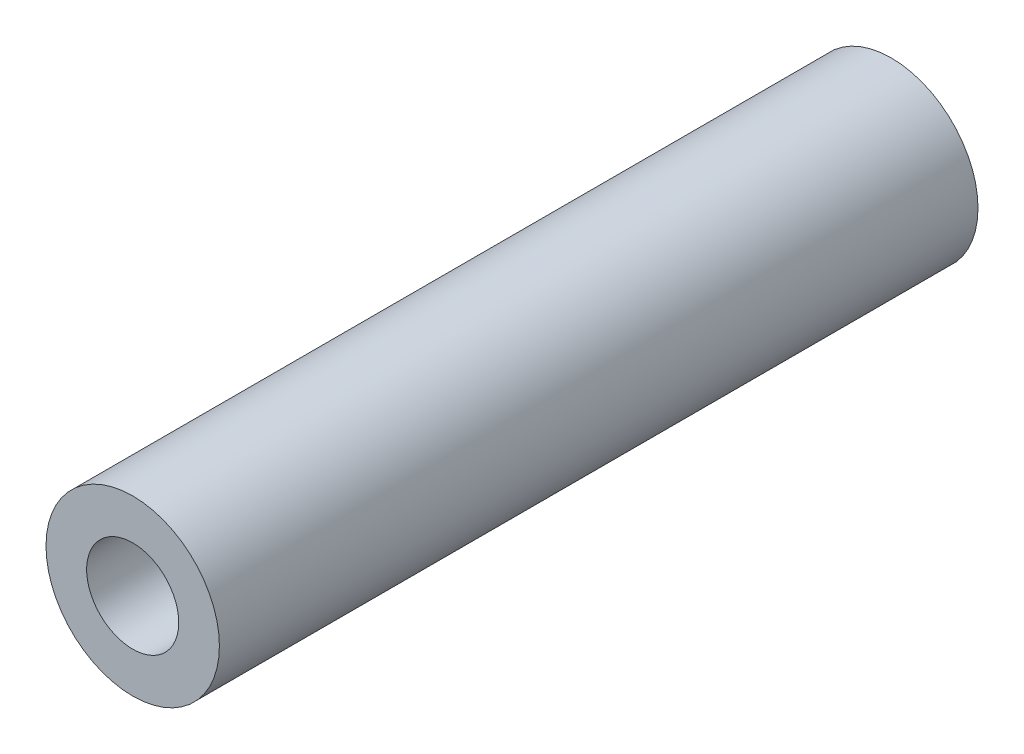
ISO-10303-21;
HEADER;
FILE_DESCRIPTION(('STEP AP214'),'2;1');
FILE_NAME('part.step','',(''),(''),'','','');
FILE_SCHEMA(('AUTOMOTIVE_DESIGN { 1 0 10303 214 1 1 1 1 }'));
ENDSEC;
DATA;
#1=APPLICATION_CONTEXT('core data for automotive mechanical design processes');
#2=APPLICATION_PROTOCOL_DEFINITION('international standard','automotive_design',2000,#1);
#3=PRODUCT_CONTEXT('',#1,'mechanical');
#4=PRODUCT('Part','Part','',(#3));
#5=PRODUCT_RELATED_PRODUCT_CATEGORY('part','',(#4));
#6=PRODUCT_DEFINITION_FORMATION('','',#4);
#7=PRODUCT_DEFINITION_CONTEXT('part definition',#1,'design');
#8=PRODUCT_DEFINITION('design','',#6,#7);
#9=PRODUCT_DEFINITION_SHAPE('','',#8);
#10=(LENGTH_UNIT() NAMED_UNIT(*) SI_UNIT(.MILLI.,.METRE.));
#11=(NAMED_UNIT(*) PLANE_ANGLE_UNIT() SI_UNIT($,.RADIAN.));
#12=(NAMED_UNIT(*) SI_UNIT($,.STERADIAN.) SOLID_ANGLE_UNIT());
#13=UNCERTAINTY_MEASURE_WITH_UNIT(LENGTH_MEASURE(1.E-05),#10,'distance_accuracy_value','');
#14=(GEOMETRIC_REPRESENTATION_CONTEXT(3) GLOBAL_UNCERTAINTY_ASSIGNED_CONTEXT((#13)) GLOBAL_UNIT_ASSIGNED_CONTEXT((#10,
#11,#12)) REPRESENTATION_CONTEXT('',''));
#15=CARTESIAN_POINT('',(0.,0.,0.));
#16=DIRECTION('',(0.,0.,1.));
#17=DIRECTION('',(1.,0.,0.));
#18=AXIS2_PLACEMENT_3D('',#15,#16,#17);
#19=CARTESIAN_POINT('',(0.,0.,70.));
#20=DIRECTION('',(0.,0.,-1.));
#21=DIRECTION('',(-1.,0.,0.));
#22=AXIS2_PLACEMENT_3D('',#19,#20,#21);
#23=CYLINDRICAL_SURFACE('',#22,8.);
#24=CARTESIAN_POINT('',(0.,0.,70.));
#25=DIRECTION('',(0.,0.,1.));
#26=DIRECTION('',(1.,0.,0.));
#27=AXIS2_PLACEMENT_3D('',#24,#25,#26);
#28=CIRCLE('',#27,8.);
#29=CARTESIAN_POINT('',(8.,0.,70.));
#30=VERTEX_POINT('',#29);
#31=EDGE_CURVE('E10',#30,#30,#28,.T.);
#32=ORIENTED_EDGE('',*,*,#31,.F.);
#33=EDGE_LOOP('',(#32));
#34=FACE_BOUND('',#33,.T.);
#35=CARTESIAN_POINT('',(0.,0.,0.));
#36=DIRECTION('',(0.,0.,1.));
#37=DIRECTION('',(1.,0.,0.));
#38=AXIS2_PLACEMENT_3D('',#35,#36,#37);
#39=CIRCLE('',#38,8.);
#40=CARTESIAN_POINT('',(8.,0.,0.));
#41=VERTEX_POINT('',#40);
#42=EDGE_CURVE('E37',#41,#41,#39,.T.);
#43=ORIENTED_EDGE('',*,*,#42,.T.);
#44=EDGE_LOOP('',(#43));
#45=FACE_BOUND('',#44,.T.);
#46=ADVANCED_FACE('F40',(#34,#45),#23,.T.);
#47=CARTESIAN_POINT('',(0.,0.,70.));
#48=DIRECTION('',(0.,0.,1.));
#49=DIRECTION('',(1.,0.,0.));
#50=AXIS2_PLACEMENT_3D('',#47,#48,#49);
#51=PLANE('',#50);
#52=CARTESIAN_POINT('',(0.,0.,70.));
#53=DIRECTION('',(0.,0.,1.));
#54=DIRECTION('',(1.,0.,0.));
#55=AXIS2_PLACEMENT_3D('',#52,#53,#54);
#56=CIRCLE('',#55,4.25);
#57=CARTESIAN_POINT('',(4.25,0.,70.));
#58=VERTEX_POINT('',#57);
#59=EDGE_CURVE('E50',#58,#58,#56,.T.);
#60=ORIENTED_EDGE('',*,*,#59,.F.);
#61=EDGE_LOOP('',(#60));
#62=FACE_BOUND('',#61,.T.);
#63=ORIENTED_EDGE('',*,*,#31,.T.);
#64=EDGE_LOOP('',(#63));
#65=FACE_BOUND('',#64,.T.);
#66=ADVANCED_FACE('F59',(#62,#65),#51,.T.);
#67=CARTESIAN_POINT('',(0.,0.,0.));
#68=DIRECTION('',(0.,0.,1.));
#69=DIRECTION('',(1.,0.,0.));
#70=AXIS2_PLACEMENT_3D('',#67,#68,#69);
#71=PLANE('',#70);
#72=ORIENTED_EDGE('',*,*,#42,.F.);
#73=EDGE_LOOP('',(#72));
#74=FACE_BOUND('',#73,.T.);
#75=ADVANCED_FACE('F58',(#74),#71,.F.);
#76=CARTESIAN_POINT('',(0.,0.,70.));
#77=DIRECTION('',(0.,0.,-1.));
#78=DIRECTION('',(-1.,0.,0.));
#79=AXIS2_PLACEMENT_3D('',#76,#77,#78);
#80=CYLINDRICAL_SURFACE('',#79,4.25);
#81=ORIENTED_EDGE('',*,*,#59,.T.);
#82=EDGE_LOOP('',(#81));
#83=FACE_BOUND('',#82,.T.);
#84=CARTESIAN_POINT('',(0.,0.,58.));
#85=DIRECTION('',(0.,0.,1.));
#86=DIRECTION('',(1.,0.,0.));
#87=AXIS2_PLACEMENT_3D('',#84,#85,#86);
#88=CIRCLE('',#87,4.25);
#89=CARTESIAN_POINT('',(4.25,0.,58.));
#90=VERTEX_POINT('',#89);
#91=EDGE_CURVE('E47',#90,#90,#88,.T.);
#92=ORIENTED_EDGE('',*,*,#91,.F.);
#93=EDGE_LOOP('',(#92));
#94=FACE_BOUND('',#93,.T.);
#95=ADVANCED_FACE('F54',(#83,#94),#80,.F.);
#96=CARTESIAN_POINT('',(0.,0.,58.));
#97=DIRECTION('',(0.,0.,1.));
#98=DIRECTION('',(1.,0.,0.));
#99=AXIS2_PLACEMENT_3D('',#96,#97,#98);
#100=PLANE('',#99);
#101=ORIENTED_EDGE('',*,*,#91,.T.);
#102=EDGE_LOOP('',(#101));
#103=FACE_BOUND('',#102,.T.);
#104=ADVANCED_FACE('F73',(#103),#100,.T.);
#105=CLOSED_SHELL('',(#46,#66,#75,#95,#104));
#106=MANIFOLD_SOLID_BREP('B2',#105);
#107=ADVANCED_BREP_SHAPE_REPRESENTATION('',(#18,#106),#14);
#108=SHAPE_DEFINITION_REPRESENTATION(#9,#107);
ENDSEC;
END-ISO-10303-21;
